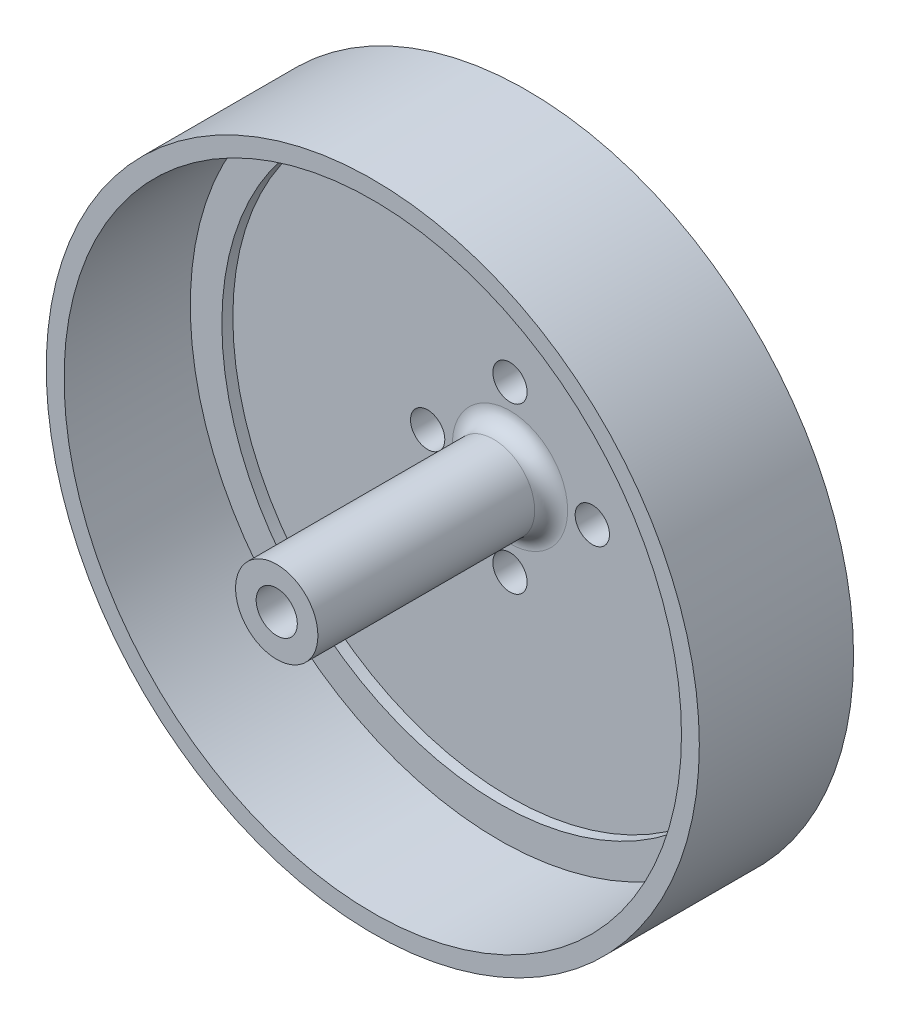
ISO-10303-21;
HEADER;
FILE_DESCRIPTION(('STEP AP214'),'2;1');
FILE_NAME('part.step','',(''),(''),'','','');
FILE_SCHEMA(('AUTOMOTIVE_DESIGN { 1 0 10303 214 1 1 1 1 }'));
ENDSEC;
DATA;
#1=APPLICATION_CONTEXT('core data for automotive mechanical design processes');
#2=APPLICATION_PROTOCOL_DEFINITION('international standard','automotive_design',2000,#1);
#3=PRODUCT_CONTEXT('',#1,'mechanical');
#4=PRODUCT('Part','Part','',(#3));
#5=PRODUCT_RELATED_PRODUCT_CATEGORY('part','',(#4));
#6=PRODUCT_DEFINITION_FORMATION('','',#4);
#7=PRODUCT_DEFINITION_CONTEXT('part definition',#1,'design');
#8=PRODUCT_DEFINITION('design','',#6,#7);
#9=PRODUCT_DEFINITION_SHAPE('','',#8);
#10=(LENGTH_UNIT() NAMED_UNIT(*) SI_UNIT(.MILLI.,.METRE.));
#11=(NAMED_UNIT(*) PLANE_ANGLE_UNIT() SI_UNIT($,.RADIAN.));
#12=(NAMED_UNIT(*) SI_UNIT($,.STERADIAN.) SOLID_ANGLE_UNIT());
#13=UNCERTAINTY_MEASURE_WITH_UNIT(LENGTH_MEASURE(1.E-05),#10,'distance_accuracy_value','');
#14=(GEOMETRIC_REPRESENTATION_CONTEXT(3) GLOBAL_UNCERTAINTY_ASSIGNED_CONTEXT((#13)) GLOBAL_UNIT_ASSIGNED_CONTEXT((#10,
#11,#12)) REPRESENTATION_CONTEXT('',''));
#15=CARTESIAN_POINT('',(0.,0.,0.));
#16=DIRECTION('',(0.,0.,1.));
#17=DIRECTION('',(1.,0.,0.));
#18=AXIS2_PLACEMENT_3D('',#15,#16,#17);
#19=CARTESIAN_POINT('',(0.,0.,12.3));
#20=DIRECTION('',(0.,0.,-1.));
#21=DIRECTION('',(-1.,0.,0.));
#22=AXIS2_PLACEMENT_3D('',#19,#20,#21);
#23=CYLINDRICAL_SURFACE('',#22,20.2);
#24=CARTESIAN_POINT('',(0.,0.,2.3));
#25=DIRECTION('',(0.,0.,1.));
#26=DIRECTION('',(1.,0.,0.));
#27=AXIS2_PLACEMENT_3D('',#24,#25,#26);
#28=CIRCLE('',#27,20.2);
#29=CARTESIAN_POINT('',(20.2,0.,2.3));
#30=VERTEX_POINT('',#29);
#31=EDGE_CURVE('E76',#30,#30,#28,.F.);
#32=ORIENTED_EDGE('',*,*,#31,.T.);
#33=EDGE_LOOP('',(#32));
#34=FACE_BOUND('',#33,.T.);
#35=CARTESIAN_POINT('',(0.,0.,3.1));
#36=DIRECTION('',(0.,0.,1.));
#37=DIRECTION('',(1.,0.,0.));
#38=AXIS2_PLACEMENT_3D('',#35,#36,#37);
#39=CIRCLE('',#38,20.2);
#40=CARTESIAN_POINT('',(20.2,0.,3.1));
#41=VERTEX_POINT('',#40);
#42=EDGE_CURVE('E56',#41,#41,#39,.T.);
#43=ORIENTED_EDGE('',*,*,#42,.T.);
#44=EDGE_LOOP('',(#43));
#45=FACE_BOUND('',#44,.T.);
#46=ADVANCED_FACE('F36',(#34,#45),#23,.F.);
#47=CARTESIAN_POINT('',(0.,0.,2.3));
#48=DIRECTION('',(0.,0.,-1.));
#49=DIRECTION('',(-1.,0.,0.));
#50=AXIS2_PLACEMENT_3D('',#47,#48,#49);
#51=CYLINDRICAL_SURFACE('',#50,23.8);
#52=CARTESIAN_POINT('',(0.,0.,1.05796188425079));
#53=DIRECTION('',(0.,0.,1.));
#54=DIRECTION('',(1.,0.,0.));
#55=AXIS2_PLACEMENT_3D('',#52,#53,#54);
#56=CIRCLE('',#55,23.8);
#57=CARTESIAN_POINT('',(23.8,0.,1.05796188425079));
#58=VERTEX_POINT('',#57);
#59=EDGE_CURVE('E79',#58,#58,#56,.T.);
#60=ORIENTED_EDGE('',*,*,#59,.T.);
#61=EDGE_LOOP('',(#60));
#62=FACE_BOUND('',#61,.T.);
#63=CARTESIAN_POINT('',(0.,0.,12.3));
#64=DIRECTION('',(0.,0.,1.));
#65=DIRECTION('',(1.,0.,0.));
#66=AXIS2_PLACEMENT_3D('',#63,#64,#65);
#67=CIRCLE('',#66,23.8);
#68=CARTESIAN_POINT('',(23.8,0.,12.3));
#69=VERTEX_POINT('',#68);
#70=EDGE_CURVE('E72',#69,#69,#67,.T.);
#71=ORIENTED_EDGE('',*,*,#70,.F.);
#72=EDGE_LOOP('',(#71));
#73=FACE_BOUND('',#72,.T.);
#74=ADVANCED_FACE('F116',(#62,#73),#51,.T.);
#75=CARTESIAN_POINT('',(0.,0.,0.));
#76=DIRECTION('',(0.,0.,1.));
#77=DIRECTION('',(1.,0.,0.));
#78=AXIS2_PLACEMENT_3D('',#75,#76,#77);
#79=PLANE('',#78);
#80=CARTESIAN_POINT('',(0.,0.,0.));
#81=DIRECTION('',(0.,0.,-1.));
#82=DIRECTION('',(-1.,0.,0.));
#83=AXIS2_PLACEMENT_3D('',#80,#81,#82);
#84=CIRCLE('',#83,9.33925413639657);
#85=CARTESIAN_POINT('',(-9.33925413639657,0.,0.));
#86=VERTEX_POINT('',#85);
#87=EDGE_CURVE('E10',#86,#86,#84,.T.);
#88=ORIENTED_EDGE('',*,*,#87,.F.);
#89=EDGE_LOOP('',(#88));
#90=FACE_BOUND('',#89,.T.);
#91=CARTESIAN_POINT('',(0.,0.,0.));
#92=DIRECTION('',(0.,0.,1.));
#93=DIRECTION('',(1.,0.,0.));
#94=AXIS2_PLACEMENT_3D('',#91,#92,#93);
#95=CIRCLE('',#94,17.7999999999999);
#96=CARTESIAN_POINT('',(17.7999999999999,0.,0.));
#97=VERTEX_POINT('',#96);
#98=EDGE_CURVE('E82',#97,#97,#95,.F.);
#99=ORIENTED_EDGE('',*,*,#98,.T.);
#100=EDGE_LOOP('',(#99));
#101=FACE_BOUND('',#100,.T.);
#102=ADVANCED_FACE('F122',(#90,#101),#79,.F.);
#103=CARTESIAN_POINT('',(0.,0.,12.3));
#104=DIRECTION('',(0.,0.,1.));
#105=DIRECTION('',(1.,0.,0.));
#106=AXIS2_PLACEMENT_3D('',#103,#104,#105);
#107=PLANE('',#106);
#108=CARTESIAN_POINT('',(0.,0.,12.3));
#109=DIRECTION('',(0.,0.,1.));
#110=DIRECTION('',(1.,0.,0.));
#111=AXIS2_PLACEMENT_3D('',#108,#109,#110);
#112=CIRCLE('',#111,22.5);
#113=CARTESIAN_POINT('',(22.5,0.,12.3));
#114=VERTEX_POINT('',#113);
#115=EDGE_CURVE('E62',#114,#114,#112,.T.);
#116=ORIENTED_EDGE('',*,*,#115,.F.);
#117=EDGE_LOOP('',(#116));
#118=FACE_BOUND('',#117,.T.);
#119=ORIENTED_EDGE('',*,*,#70,.T.);
#120=EDGE_LOOP('',(#119));
#121=FACE_BOUND('',#120,.T.);
#122=ADVANCED_FACE('F129',(#118,#121),#107,.T.);
#123=CARTESIAN_POINT('',(0.,0.,2.3));
#124=DIRECTION('',(0.,0.,1.));
#125=DIRECTION('',(1.,0.,0.));
#126=AXIS2_PLACEMENT_3D('',#123,#124,#125);
#127=PLANE('',#126);
#128=CARTESIAN_POINT('',(0.,0.,2.3));
#129=DIRECTION('',(0.,0.,1.));
#130=DIRECTION('',(1.,0.,0.));
#131=AXIS2_PLACEMENT_3D('',#128,#129,#130);
#132=CIRCLE('',#131,4.2);
#133=CARTESIAN_POINT('',(4.2,0.,2.3));
#134=VERTEX_POINT('',#133);
#135=EDGE_CURVE('E40',#134,#134,#132,.F.);
#136=ORIENTED_EDGE('',*,*,#135,.T.);
#137=EDGE_LOOP('',(#136));
#138=FACE_BOUND('',#137,.T.);
#139=CARTESIAN_POINT('',(-6.,0.,2.3));
#140=DIRECTION('',(0.,0.,1.));
#141=DIRECTION('',(1.,0.,0.));
#142=AXIS2_PLACEMENT_3D('',#139,#140,#141);
#143=CIRCLE('',#142,1.25);
#144=CARTESIAN_POINT('',(-4.75,0.,2.3));
#145=VERTEX_POINT('',#144);
#146=EDGE_CURVE('E73',#145,#145,#143,.T.);
#147=ORIENTED_EDGE('',*,*,#146,.F.);
#148=EDGE_LOOP('',(#147));
#149=FACE_BOUND('',#148,.T.);
#150=CARTESIAN_POINT('',(0.,-6.,2.3));
#151=DIRECTION('',(0.,0.,1.));
#152=DIRECTION('',(1.,0.,0.));
#153=AXIS2_PLACEMENT_3D('',#150,#151,#152);
#154=CIRCLE('',#153,1.25);
#155=CARTESIAN_POINT('',(1.25000000000002,-6.,2.3));
#156=VERTEX_POINT('',#155);
#157=EDGE_CURVE('E90',#156,#156,#154,.T.);
#158=ORIENTED_EDGE('',*,*,#157,.F.);
#159=EDGE_LOOP('',(#158));
#160=FACE_BOUND('',#159,.T.);
#161=CARTESIAN_POINT('',(6.,0.,2.3));
#162=DIRECTION('',(0.,0.,1.));
#163=DIRECTION('',(1.,0.,0.));
#164=AXIS2_PLACEMENT_3D('',#161,#162,#163);
#165=CIRCLE('',#164,1.25);
#166=CARTESIAN_POINT('',(7.25,0.,2.3));
#167=VERTEX_POINT('',#166);
#168=EDGE_CURVE('E87',#167,#167,#165,.T.);
#169=ORIENTED_EDGE('',*,*,#168,.F.);
#170=EDGE_LOOP('',(#169));
#171=FACE_BOUND('',#170,.T.);
#172=CARTESIAN_POINT('',(0.,6.,2.3));
#173=DIRECTION('',(0.,0.,1.));
#174=DIRECTION('',(1.,0.,0.));
#175=AXIS2_PLACEMENT_3D('',#172,#173,#174);
#176=CIRCLE('',#175,1.25);
#177=CARTESIAN_POINT('',(1.24999999999994,6.,2.3));
#178=VERTEX_POINT('',#177);
#179=EDGE_CURVE('E66',#178,#178,#176,.T.);
#180=ORIENTED_EDGE('',*,*,#179,.F.);
#181=EDGE_LOOP('',(#180));
#182=FACE_BOUND('',#181,.T.);
#183=ORIENTED_EDGE('',*,*,#31,.F.);
#184=EDGE_LOOP('',(#183));
#185=FACE_BOUND('',#184,.T.);
#186=ADVANCED_FACE('F132',(#138,#149,#160,#171,#182,#185),#127,.T.);
#187=CARTESIAN_POINT('',(0.,0.,19.3));
#188=DIRECTION('',(0.,0.,-1.));
#189=DIRECTION('',(-1.,0.,0.));
#190=AXIS2_PLACEMENT_3D('',#187,#188,#189);
#191=CYLINDRICAL_SURFACE('',#190,3.);
#192=CARTESIAN_POINT('',(0.,0.,3.5));
#193=DIRECTION('',(0.,0.,1.));
#194=DIRECTION('',(1.,0.,0.));
#195=AXIS2_PLACEMENT_3D('',#192,#193,#194);
#196=CIRCLE('',#195,3.);
#197=CARTESIAN_POINT('',(3.,0.,3.5));
#198=VERTEX_POINT('',#197);
#199=EDGE_CURVE('E48',#198,#198,#196,.T.);
#200=ORIENTED_EDGE('',*,*,#199,.T.);
#201=EDGE_LOOP('',(#200));
#202=FACE_BOUND('',#201,.T.);
#203=CARTESIAN_POINT('',(0.,0.,19.3));
#204=DIRECTION('',(0.,0.,1.));
#205=DIRECTION('',(1.,0.,0.));
#206=AXIS2_PLACEMENT_3D('',#203,#204,#205);
#207=CIRCLE('',#206,3.);
#208=CARTESIAN_POINT('',(3.,0.,19.3));
#209=VERTEX_POINT('',#208);
#210=EDGE_CURVE('E69',#209,#209,#207,.T.);
#211=ORIENTED_EDGE('',*,*,#210,.F.);
#212=EDGE_LOOP('',(#211));
#213=FACE_BOUND('',#212,.T.);
#214=ADVANCED_FACE('F97',(#202,#213),#191,.T.);
#215=CARTESIAN_POINT('',(0.,0.,19.3));
#216=DIRECTION('',(0.,0.,1.));
#217=DIRECTION('',(1.,0.,0.));
#218=AXIS2_PLACEMENT_3D('',#215,#216,#217);
#219=PLANE('',#218);
#220=CARTESIAN_POINT('',(0.,0.,19.3));
#221=DIRECTION('',(0.,0.,1.));
#222=DIRECTION('',(1.,0.,0.));
#223=AXIS2_PLACEMENT_3D('',#220,#221,#222);
#224=CIRCLE('',#223,1.5);
#225=CARTESIAN_POINT('',(1.5,0.,19.3));
#226=VERTEX_POINT('',#225);
#227=EDGE_CURVE('E57',#226,#226,#224,.T.);
#228=ORIENTED_EDGE('',*,*,#227,.F.);
#229=EDGE_LOOP('',(#228));
#230=FACE_BOUND('',#229,.T.);
#231=ORIENTED_EDGE('',*,*,#210,.T.);
#232=EDGE_LOOP('',(#231));
#233=FACE_BOUND('',#232,.T.);
#234=ADVANCED_FACE('F142',(#230,#233),#219,.T.);
#235=CARTESIAN_POINT('',(0.,0.,1.05796188425079));
#236=DIRECTION('',(0.,0.,1.));
#237=DIRECTION('',(1.,0.,0.));
#238=AXIS2_PLACEMENT_3D('',#235,#236,#237);
#239=CONICAL_SURFACE('',#238,23.8,1.39626340159547);
#240=ORIENTED_EDGE('',*,*,#98,.F.);
#241=EDGE_LOOP('',(#240));
#242=FACE_BOUND('',#241,.T.);
#243=ORIENTED_EDGE('',*,*,#59,.F.);
#244=EDGE_LOOP('',(#243));
#245=FACE_BOUND('',#244,.T.);
#246=ADVANCED_FACE('F139',(#242,#245),#239,.T.);
#247=CARTESIAN_POINT('',(0.,6.,15.));
#248=DIRECTION('',(0.,0.,-1.));
#249=DIRECTION('',(-1.,0.,0.));
#250=AXIS2_PLACEMENT_3D('',#247,#248,#249);
#251=CYLINDRICAL_SURFACE('',#250,1.25);
#252=ORIENTED_EDGE('',*,*,#179,.T.);
#253=EDGE_LOOP('',(#252));
#254=FACE_BOUND('',#253,.T.);
#255=CARTESIAN_POINT('',(0.,6.,-1.6));
#256=DIRECTION('',(0.,0.,-1.));
#257=DIRECTION('',(-1.,0.,0.));
#258=AXIS2_PLACEMENT_3D('',#255,#256,#257);
#259=CIRCLE('',#258,1.25);
#260=CARTESIAN_POINT('',(-1.25000000000006,6.,-1.6));
#261=VERTEX_POINT('',#260);
#262=EDGE_CURVE('E215',#261,#261,#259,.T.);
#263=ORIENTED_EDGE('',*,*,#262,.T.);
#264=EDGE_LOOP('',(#263));
#265=FACE_BOUND('',#264,.T.);
#266=ADVANCED_FACE('F141',(#254,#265),#251,.F.);
#267=CARTESIAN_POINT('',(6.,0.,15.));
#268=DIRECTION('',(0.,0.,-1.));
#269=DIRECTION('',(-1.,0.,0.));
#270=AXIS2_PLACEMENT_3D('',#267,#268,#269);
#271=CYLINDRICAL_SURFACE('',#270,1.25);
#272=ORIENTED_EDGE('',*,*,#168,.T.);
#273=EDGE_LOOP('',(#272));
#274=FACE_BOUND('',#273,.T.);
#275=CARTESIAN_POINT('',(6.,0.,-1.6));
#276=DIRECTION('',(0.,0.,-1.));
#277=DIRECTION('',(-1.,0.,0.));
#278=AXIS2_PLACEMENT_3D('',#275,#276,#277);
#279=CIRCLE('',#278,1.25);
#280=CARTESIAN_POINT('',(4.75,0.,-1.6));
#281=VERTEX_POINT('',#280);
#282=EDGE_CURVE('E202',#281,#281,#279,.T.);
#283=ORIENTED_EDGE('',*,*,#282,.T.);
#284=EDGE_LOOP('',(#283));
#285=FACE_BOUND('',#284,.T.);
#286=ADVANCED_FACE('F148',(#274,#285),#271,.F.);
#287=CARTESIAN_POINT('',(0.,-6.,15.));
#288=DIRECTION('',(0.,0.,-1.));
#289=DIRECTION('',(-1.,0.,0.));
#290=AXIS2_PLACEMENT_3D('',#287,#288,#289);
#291=CYLINDRICAL_SURFACE('',#290,1.25);
#292=ORIENTED_EDGE('',*,*,#157,.T.);
#293=EDGE_LOOP('',(#292));
#294=FACE_BOUND('',#293,.T.);
#295=CARTESIAN_POINT('',(0.,-6.,-1.6));
#296=DIRECTION('',(0.,0.,-1.));
#297=DIRECTION('',(-1.,0.,0.));
#298=AXIS2_PLACEMENT_3D('',#295,#296,#297);
#299=CIRCLE('',#298,1.25);
#300=CARTESIAN_POINT('',(-1.24999999999998,-6.,-1.6));
#301=VERTEX_POINT('',#300);
#302=EDGE_CURVE('E206',#301,#301,#299,.T.);
#303=ORIENTED_EDGE('',*,*,#302,.T.);
#304=EDGE_LOOP('',(#303));
#305=FACE_BOUND('',#304,.T.);
#306=ADVANCED_FACE('F167',(#294,#305),#291,.F.);
#307=CARTESIAN_POINT('',(-6.,0.,15.));
#308=DIRECTION('',(0.,0.,-1.));
#309=DIRECTION('',(-1.,0.,0.));
#310=AXIS2_PLACEMENT_3D('',#307,#308,#309);
#311=CYLINDRICAL_SURFACE('',#310,1.25);
#312=ORIENTED_EDGE('',*,*,#146,.T.);
#313=EDGE_LOOP('',(#312));
#314=FACE_BOUND('',#313,.T.);
#315=CARTESIAN_POINT('',(-6.,0.,-1.6));
#316=DIRECTION('',(0.,0.,-1.));
#317=DIRECTION('',(-1.,0.,0.));
#318=AXIS2_PLACEMENT_3D('',#315,#316,#317);
#319=CIRCLE('',#318,1.25);
#320=CARTESIAN_POINT('',(-7.25,0.,-1.6));
#321=VERTEX_POINT('',#320);
#322=EDGE_CURVE('E213',#321,#321,#319,.T.);
#323=ORIENTED_EDGE('',*,*,#322,.T.);
#324=EDGE_LOOP('',(#323));
#325=FACE_BOUND('',#324,.T.);
#326=ADVANCED_FACE('F171',(#314,#325),#311,.F.);
#327=CARTESIAN_POINT('',(0.,0.,3.1));
#328=DIRECTION('',(0.,0.,1.));
#329=DIRECTION('',(1.,0.,0.));
#330=AXIS2_PLACEMENT_3D('',#327,#328,#329);
#331=CYLINDRICAL_SURFACE('',#330,22.5);
#332=CARTESIAN_POINT('',(0.,0.,3.1));
#333=DIRECTION('',(0.,0.,1.));
#334=DIRECTION('',(1.,0.,0.));
#335=AXIS2_PLACEMENT_3D('',#332,#333,#334);
#336=CIRCLE('',#335,22.5);
#337=CARTESIAN_POINT('',(22.5,0.,3.1));
#338=VERTEX_POINT('',#337);
#339=EDGE_CURVE('E63',#338,#338,#336,.T.);
#340=ORIENTED_EDGE('',*,*,#339,.F.);
#341=EDGE_LOOP('',(#340));
#342=FACE_BOUND('',#341,.T.);
#343=ORIENTED_EDGE('',*,*,#115,.T.);
#344=EDGE_LOOP('',(#343));
#345=FACE_BOUND('',#344,.T.);
#346=ADVANCED_FACE('F175',(#342,#345),#331,.F.);
#347=CARTESIAN_POINT('',(0.,0.,3.1));
#348=DIRECTION('',(0.,0.,1.));
#349=DIRECTION('',(1.,0.,0.));
#350=AXIS2_PLACEMENT_3D('',#347,#348,#349);
#351=PLANE('',#350);
#352=ORIENTED_EDGE('',*,*,#42,.F.);
#353=EDGE_LOOP('',(#352));
#354=FACE_BOUND('',#353,.T.);
#355=ORIENTED_EDGE('',*,*,#339,.T.);
#356=EDGE_LOOP('',(#355));
#357=FACE_BOUND('',#356,.T.);
#358=ADVANCED_FACE('F179',(#354,#357),#351,.T.);
#359=CARTESIAN_POINT('',(0.,0.,14.3));
#360=DIRECTION('',(0.,0.,1.));
#361=DIRECTION('',(1.,0.,0.));
#362=AXIS2_PLACEMENT_3D('',#359,#360,#361);
#363=CYLINDRICAL_SURFACE('',#362,1.5);
#364=CARTESIAN_POINT('',(0.,0.,14.3));
#365=DIRECTION('',(0.,0.,1.));
#366=DIRECTION('',(1.,0.,0.));
#367=AXIS2_PLACEMENT_3D('',#364,#365,#366);
#368=CIRCLE('',#367,1.5);
#369=CARTESIAN_POINT('',(1.5,0.,14.3));
#370=VERTEX_POINT('',#369);
#371=EDGE_CURVE('E53',#370,#370,#368,.T.);
#372=ORIENTED_EDGE('',*,*,#371,.F.);
#373=EDGE_LOOP('',(#372));
#374=FACE_BOUND('',#373,.T.);
#375=ORIENTED_EDGE('',*,*,#227,.T.);
#376=EDGE_LOOP('',(#375));
#377=FACE_BOUND('',#376,.T.);
#378=ADVANCED_FACE('F111',(#374,#377),#363,.F.);
#379=CARTESIAN_POINT('',(0.,0.,14.3));
#380=DIRECTION('',(0.,0.,1.));
#381=DIRECTION('',(1.,0.,0.));
#382=AXIS2_PLACEMENT_3D('',#379,#380,#381);
#383=PLANE('',#382);
#384=ORIENTED_EDGE('',*,*,#371,.T.);
#385=EDGE_LOOP('',(#384));
#386=FACE_BOUND('',#385,.T.);
#387=ADVANCED_FACE('F102',(#386),#383,.T.);
#388=CARTESIAN_POINT('',(0.,0.,3.5));
#389=DIRECTION('',(0.,0.,1.));
#390=DIRECTION('',(1.,0.,0.));
#391=AXIS2_PLACEMENT_3D('',#388,#389,#390);
#392=TOROIDAL_SURFACE('',#391,4.2,1.2);
#393=ORIENTED_EDGE('',*,*,#135,.F.);
#394=EDGE_LOOP('',(#393));
#395=FACE_BOUND('',#394,.T.);
#396=ORIENTED_EDGE('',*,*,#199,.F.);
#397=EDGE_LOOP('',(#396));
#398=FACE_BOUND('',#397,.T.);
#399=ADVANCED_FACE('F38',(#395,#398),#392,.F.);
#400=CARTESIAN_POINT('',(0.,0.,-1.6));
#401=DIRECTION('',(0.,0.,-1.));
#402=DIRECTION('',(-1.,0.,0.));
#403=AXIS2_PLACEMENT_3D('',#400,#401,#402);
#404=PLANE('',#403);
#405=CARTESIAN_POINT('',(0.,0.,-1.6));
#406=DIRECTION('',(0.,0.,-1.));
#407=DIRECTION('',(-1.,0.,0.));
#408=AXIS2_PLACEMENT_3D('',#405,#406,#407);
#409=CIRCLE('',#408,2.);
#410=CARTESIAN_POINT('',(-2.,0.,-1.6));
#411=VERTEX_POINT('',#410);
#412=EDGE_CURVE('E203',#411,#411,#409,.T.);
#413=ORIENTED_EDGE('',*,*,#412,.F.);
#414=EDGE_LOOP('',(#413));
#415=FACE_BOUND('',#414,.T.);
#416=ORIENTED_EDGE('',*,*,#302,.F.);
#417=EDGE_LOOP('',(#416));
#418=FACE_BOUND('',#417,.T.);
#419=ORIENTED_EDGE('',*,*,#262,.F.);
#420=EDGE_LOOP('',(#419));
#421=FACE_BOUND('',#420,.T.);
#422=CARTESIAN_POINT('',(0.,0.,-1.6));
#423=DIRECTION('',(0.,0.,-1.));
#424=DIRECTION('',(-1.,0.,0.));
#425=AXIS2_PLACEMENT_3D('',#422,#423,#424);
#426=CIRCLE('',#425,9.33925413639657);
#427=CARTESIAN_POINT('',(-9.33925413639657,0.,-1.6));
#428=VERTEX_POINT('',#427);
#429=EDGE_CURVE('E51',#428,#428,#426,.T.);
#430=ORIENTED_EDGE('',*,*,#429,.T.);
#431=EDGE_LOOP('',(#430));
#432=FACE_BOUND('',#431,.T.);
#433=ORIENTED_EDGE('',*,*,#322,.F.);
#434=EDGE_LOOP('',(#433));
#435=FACE_BOUND('',#434,.T.);
#436=ORIENTED_EDGE('',*,*,#282,.F.);
#437=EDGE_LOOP('',(#436));
#438=FACE_BOUND('',#437,.T.);
#439=ADVANCED_FACE('F101',(#415,#418,#421,#432,#435,#438),#404,.T.);
#440=CARTESIAN_POINT('',(0.,0.,-1.6));
#441=DIRECTION('',(0.,0.,1.));
#442=DIRECTION('',(1.,0.,0.));
#443=AXIS2_PLACEMENT_3D('',#440,#441,#442);
#444=CYLINDRICAL_SURFACE('',#443,9.33925413639657);
#445=ORIENTED_EDGE('',*,*,#429,.F.);
#446=EDGE_LOOP('',(#445));
#447=FACE_BOUND('',#446,.T.);
#448=ORIENTED_EDGE('',*,*,#87,.T.);
#449=EDGE_LOOP('',(#448));
#450=FACE_BOUND('',#449,.T.);
#451=ADVANCED_FACE('F108',(#447,#450),#444,.T.);
#452=CARTESIAN_POINT('',(0.,0.,-4.6));
#453=DIRECTION('',(0.,0.,1.));
#454=DIRECTION('',(1.,0.,0.));
#455=AXIS2_PLACEMENT_3D('',#452,#453,#454);
#456=CYLINDRICAL_SURFACE('',#455,2.);
#457=CARTESIAN_POINT('',(0.,0.,-4.6));
#458=DIRECTION('',(0.,0.,-1.));
#459=DIRECTION('',(-1.,0.,0.));
#460=AXIS2_PLACEMENT_3D('',#457,#458,#459);
#461=CIRCLE('',#460,2.);
#462=CARTESIAN_POINT('',(-2.,0.,-4.6));
#463=VERTEX_POINT('',#462);
#464=EDGE_CURVE('E201',#463,#463,#461,.T.);
#465=ORIENTED_EDGE('',*,*,#464,.F.);
#466=EDGE_LOOP('',(#465));
#467=FACE_BOUND('',#466,.T.);
#468=ORIENTED_EDGE('',*,*,#412,.T.);
#469=EDGE_LOOP('',(#468));
#470=FACE_BOUND('',#469,.T.);
#471=ADVANCED_FACE('F188',(#467,#470),#456,.T.);
#472=CARTESIAN_POINT('',(0.,0.,-4.6));
#473=DIRECTION('',(0.,0.,-1.));
#474=DIRECTION('',(-1.,0.,0.));
#475=AXIS2_PLACEMENT_3D('',#472,#473,#474);
#476=PLANE('',#475);
#477=ORIENTED_EDGE('',*,*,#464,.T.);
#478=EDGE_LOOP('',(#477));
#479=FACE_BOUND('',#478,.T.);
#480=ADVANCED_FACE('F193',(#479),#476,.T.);
#481=CLOSED_SHELL('',(#46,#74,#102,#122,#186,#214,#234,#246,#266,#286,#306,#326,#346,#358,#378,
#387,#399,#439,#451,#471,#480));
#482=MANIFOLD_SOLID_BREP('B2',#481);
#483=ADVANCED_BREP_SHAPE_REPRESENTATION('',(#18,#482),#14);
#484=SHAPE_DEFINITION_REPRESENTATION(#9,#483);
ENDSEC;
END-ISO-10303-21;
